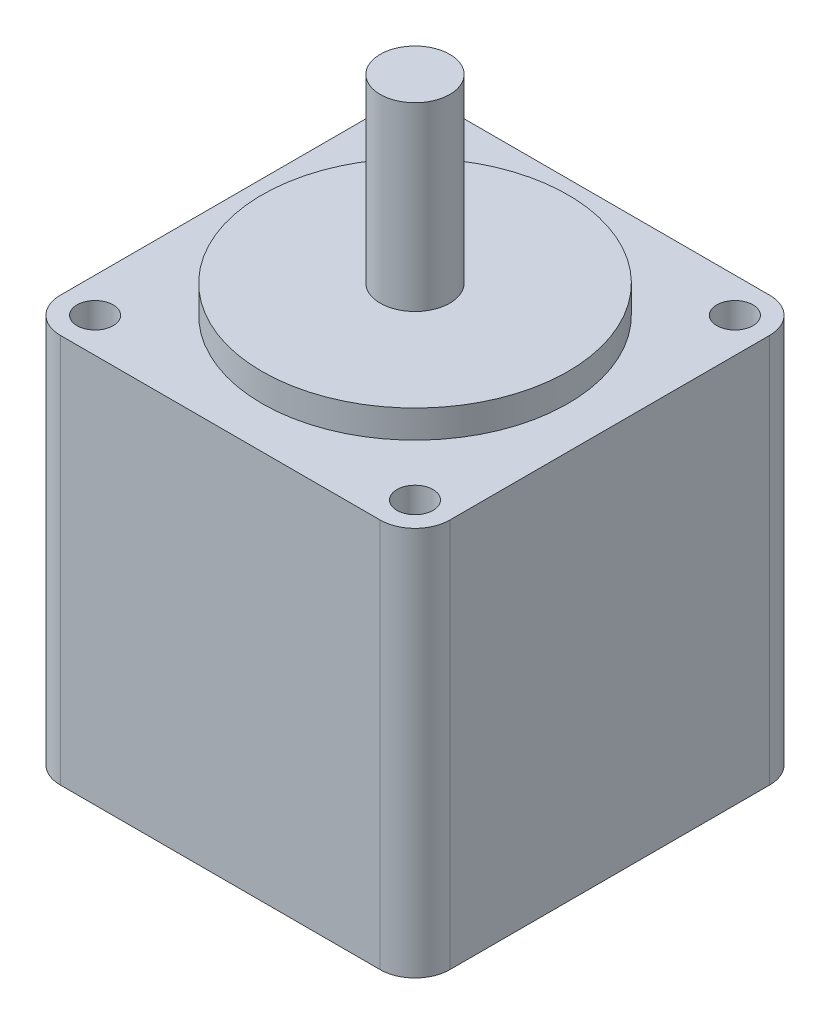
ISO-10303-21;
HEADER;
FILE_DESCRIPTION(('STEP AP214'),'2;1');
FILE_NAME('part.step','',(''),(''),'','','');
FILE_SCHEMA(('AUTOMOTIVE_DESIGN { 1 0 10303 214 1 1 1 1 }'));
ENDSEC;
DATA;
#1=APPLICATION_CONTEXT('core data for automotive mechanical design processes');
#2=APPLICATION_PROTOCOL_DEFINITION('international standard','automotive_design',2000,#1);
#3=PRODUCT_CONTEXT('',#1,'mechanical');
#4=PRODUCT('Part','Part','',(#3));
#5=PRODUCT_RELATED_PRODUCT_CATEGORY('part','',(#4));
#6=PRODUCT_DEFINITION_FORMATION('','',#4);
#7=PRODUCT_DEFINITION_CONTEXT('part definition',#1,'design');
#8=PRODUCT_DEFINITION('design','',#6,#7);
#9=PRODUCT_DEFINITION_SHAPE('','',#8);
#10=(LENGTH_UNIT() NAMED_UNIT(*) SI_UNIT(.MILLI.,.METRE.));
#11=(NAMED_UNIT(*) PLANE_ANGLE_UNIT() SI_UNIT($,.RADIAN.));
#12=(NAMED_UNIT(*) SI_UNIT($,.STERADIAN.) SOLID_ANGLE_UNIT());
#13=UNCERTAINTY_MEASURE_WITH_UNIT(LENGTH_MEASURE(1.E-05),#10,'distance_accuracy_value','');
#14=(GEOMETRIC_REPRESENTATION_CONTEXT(3) GLOBAL_UNCERTAINTY_ASSIGNED_CONTEXT((#13)) GLOBAL_UNIT_ASSIGNED_CONTEXT((#10,
#11,#12)) REPRESENTATION_CONTEXT('',''));
#15=CARTESIAN_POINT('',(0.,0.,0.));
#16=DIRECTION('',(0.,0.,1.));
#17=DIRECTION('',(1.,0.,0.));
#18=AXIS2_PLACEMENT_3D('',#15,#16,#17);
#19=CARTESIAN_POINT('',(-11.5,28.,11.5));
#20=DIRECTION('',(0.,-1.,0.));
#21=DIRECTION('',(0.,0.,-1.));
#22=AXIS2_PLACEMENT_3D('',#19,#20,#21);
#23=CYLINDRICAL_SURFACE('',#22,2.5);
#24=CARTESIAN_POINT('',(-11.5,0.,11.5));
#25=DIRECTION('',(0.,1.,0.));
#26=DIRECTION('',(0.,0.,1.));
#27=AXIS2_PLACEMENT_3D('',#24,#25,#26);
#28=CIRCLE('',#27,2.5);
#29=CARTESIAN_POINT('',(-14.,0.,11.5));
#30=VERTEX_POINT('',#29);
#31=CARTESIAN_POINT('',(-11.5,0.,14.));
#32=VERTEX_POINT('',#31);
#33=EDGE_CURVE('E138',#30,#32,#28,.T.);
#34=ORIENTED_EDGE('',*,*,#33,.T.);
#35=DIRECTION('',(0.,-1.,0.));
#36=VECTOR('',#35,1.);
#37=CARTESIAN_POINT('',(-11.5,28.,14.));
#38=LINE('',#37,#36);
#39=CARTESIAN_POINT('',(-11.5,28.,14.));
#40=VERTEX_POINT('',#39);
#41=EDGE_CURVE('E42',#40,#32,#38,.T.);
#42=ORIENTED_EDGE('',*,*,#41,.F.);
#43=CARTESIAN_POINT('',(-11.5,28.,11.5));
#44=DIRECTION('',(0.,1.,0.));
#45=DIRECTION('',(0.,0.,1.));
#46=AXIS2_PLACEMENT_3D('',#43,#44,#45);
#47=CIRCLE('',#46,2.5);
#48=CARTESIAN_POINT('',(-14.,28.,11.5));
#49=VERTEX_POINT('',#48);
#50=EDGE_CURVE('E154',#49,#40,#47,.T.);
#51=ORIENTED_EDGE('',*,*,#50,.F.);
#52=DIRECTION('',(0.,-1.,0.));
#53=VECTOR('',#52,1.);
#54=CARTESIAN_POINT('',(-14.,28.,11.5));
#55=LINE('',#54,#53);
#56=EDGE_CURVE('E137',#49,#30,#55,.T.);
#57=ORIENTED_EDGE('',*,*,#56,.T.);
#58=EDGE_LOOP('',(#34,#42,#51,#57));
#59=FACE_BOUND('',#58,.T.);
#60=ADVANCED_FACE('F41',(#59),#23,.T.);
#61=CARTESIAN_POINT('',(-11.5,28.,14.));
#62=DIRECTION('',(0.,0.,-1.));
#63=DIRECTION('',(-1.,0.,0.));
#64=AXIS2_PLACEMENT_3D('',#61,#62,#63);
#65=PLANE('',#64);
#66=DIRECTION('',(1.,0.,0.));
#67=VECTOR('',#66,1.);
#68=CARTESIAN_POINT('',(-11.5,0.,14.));
#69=LINE('',#68,#67);
#70=CARTESIAN_POINT('',(11.5,0.,14.));
#71=VERTEX_POINT('',#70);
#72=EDGE_CURVE('E145',#32,#71,#69,.T.);
#73=ORIENTED_EDGE('',*,*,#72,.T.);
#74=DIRECTION('',(0.,-1.,0.));
#75=VECTOR('',#74,1.);
#76=CARTESIAN_POINT('',(11.5,28.,14.));
#77=LINE('',#76,#75);
#78=CARTESIAN_POINT('',(11.5,28.,14.));
#79=VERTEX_POINT('',#78);
#80=EDGE_CURVE('E161',#79,#71,#77,.T.);
#81=ORIENTED_EDGE('',*,*,#80,.F.);
#82=DIRECTION('',(1.,0.,0.));
#83=VECTOR('',#82,1.);
#84=CARTESIAN_POINT('',(-11.5,28.,14.));
#85=LINE('',#84,#83);
#86=EDGE_CURVE('E103',#40,#79,#85,.T.);
#87=ORIENTED_EDGE('',*,*,#86,.F.);
#88=ORIENTED_EDGE('',*,*,#41,.T.);
#89=EDGE_LOOP('',(#73,#81,#87,#88));
#90=FACE_BOUND('',#89,.T.);
#91=ADVANCED_FACE('F209',(#90),#65,.F.);
#92=CARTESIAN_POINT('',(11.5,28.,11.5));
#93=DIRECTION('',(0.,-1.,0.));
#94=DIRECTION('',(0.,0.,-1.));
#95=AXIS2_PLACEMENT_3D('',#92,#93,#94);
#96=CYLINDRICAL_SURFACE('',#95,2.5);
#97=CARTESIAN_POINT('',(11.5,0.,11.5));
#98=DIRECTION('',(0.,1.,0.));
#99=DIRECTION('',(0.,0.,1.));
#100=AXIS2_PLACEMENT_3D('',#97,#98,#99);
#101=CIRCLE('',#100,2.5);
#102=CARTESIAN_POINT('',(14.,0.,11.5));
#103=VERTEX_POINT('',#102);
#104=EDGE_CURVE('E148',#71,#103,#101,.T.);
#105=ORIENTED_EDGE('',*,*,#104,.T.);
#106=DIRECTION('',(0.,-1.,0.));
#107=VECTOR('',#106,1.);
#108=CARTESIAN_POINT('',(14.,28.,11.5));
#109=LINE('',#108,#107);
#110=CARTESIAN_POINT('',(14.,28.,11.5));
#111=VERTEX_POINT('',#110);
#112=EDGE_CURVE('E165',#111,#103,#109,.T.);
#113=ORIENTED_EDGE('',*,*,#112,.F.);
#114=CARTESIAN_POINT('',(11.5,28.,11.5));
#115=DIRECTION('',(0.,1.,0.));
#116=DIRECTION('',(0.,0.,1.));
#117=AXIS2_PLACEMENT_3D('',#114,#115,#116);
#118=CIRCLE('',#117,2.5);
#119=EDGE_CURVE('E178',#79,#111,#118,.T.);
#120=ORIENTED_EDGE('',*,*,#119,.F.);
#121=ORIENTED_EDGE('',*,*,#80,.T.);
#122=EDGE_LOOP('',(#105,#113,#120,#121));
#123=FACE_BOUND('',#122,.T.);
#124=ADVANCED_FACE('F215',(#123),#96,.T.);
#125=CARTESIAN_POINT('',(14.,28.,-11.5));
#126=DIRECTION('',(-1.,0.,0.));
#127=DIRECTION('',(0.,0.,1.));
#128=AXIS2_PLACEMENT_3D('',#125,#126,#127);
#129=PLANE('',#128);
#130=DIRECTION('',(0.,0.,-1.));
#131=VECTOR('',#130,1.);
#132=CARTESIAN_POINT('',(14.,0.,-11.5));
#133=LINE('',#132,#131);
#134=CARTESIAN_POINT('',(14.,0.,-11.5));
#135=VERTEX_POINT('',#134);
#136=EDGE_CURVE('E147',#103,#135,#133,.T.);
#137=ORIENTED_EDGE('',*,*,#136,.T.);
#138=DIRECTION('',(0.,-1.,0.));
#139=VECTOR('',#138,1.);
#140=CARTESIAN_POINT('',(14.,28.,-11.5));
#141=LINE('',#140,#139);
#142=CARTESIAN_POINT('',(14.,28.,-11.5));
#143=VERTEX_POINT('',#142);
#144=EDGE_CURVE('E159',#143,#135,#141,.T.);
#145=ORIENTED_EDGE('',*,*,#144,.F.);
#146=DIRECTION('',(0.,0.,-1.));
#147=VECTOR('',#146,1.);
#148=CARTESIAN_POINT('',(14.,28.,-11.5));
#149=LINE('',#148,#147);
#150=EDGE_CURVE('E179',#111,#143,#149,.T.);
#151=ORIENTED_EDGE('',*,*,#150,.F.);
#152=ORIENTED_EDGE('',*,*,#112,.T.);
#153=EDGE_LOOP('',(#137,#145,#151,#152));
#154=FACE_BOUND('',#153,.T.);
#155=ADVANCED_FACE('F184',(#154),#129,.F.);
#156=CARTESIAN_POINT('',(11.5,28.,-11.5));
#157=DIRECTION('',(0.,-1.,0.));
#158=DIRECTION('',(0.,0.,-1.));
#159=AXIS2_PLACEMENT_3D('',#156,#157,#158);
#160=CYLINDRICAL_SURFACE('',#159,2.5);
#161=CARTESIAN_POINT('',(11.5,0.,-11.5));
#162=DIRECTION('',(0.,1.,0.));
#163=DIRECTION('',(0.,0.,1.));
#164=AXIS2_PLACEMENT_3D('',#161,#162,#163);
#165=CIRCLE('',#164,2.5);
#166=CARTESIAN_POINT('',(11.5,0.,-14.));
#167=VERTEX_POINT('',#166);
#168=EDGE_CURVE('E146',#135,#167,#165,.T.);
#169=ORIENTED_EDGE('',*,*,#168,.T.);
#170=DIRECTION('',(0.,-1.,0.));
#171=VECTOR('',#170,1.);
#172=CARTESIAN_POINT('',(11.5,28.,-14.));
#173=LINE('',#172,#171);
#174=CARTESIAN_POINT('',(11.5,28.,-14.));
#175=VERTEX_POINT('',#174);
#176=EDGE_CURVE('E132',#175,#167,#173,.T.);
#177=ORIENTED_EDGE('',*,*,#176,.F.);
#178=CARTESIAN_POINT('',(11.5,28.,-11.5));
#179=DIRECTION('',(0.,1.,0.));
#180=DIRECTION('',(0.,0.,1.));
#181=AXIS2_PLACEMENT_3D('',#178,#179,#180);
#182=CIRCLE('',#181,2.5);
#183=EDGE_CURVE('E125',#143,#175,#182,.T.);
#184=ORIENTED_EDGE('',*,*,#183,.F.);
#185=ORIENTED_EDGE('',*,*,#144,.T.);
#186=EDGE_LOOP('',(#169,#177,#184,#185));
#187=FACE_BOUND('',#186,.T.);
#188=ADVANCED_FACE('F189',(#187),#160,.T.);
#189=CARTESIAN_POINT('',(-11.5,28.,-14.));
#190=DIRECTION('',(0.,0.,1.));
#191=DIRECTION('',(1.,0.,0.));
#192=AXIS2_PLACEMENT_3D('',#189,#190,#191);
#193=PLANE('',#192);
#194=DIRECTION('',(-1.,0.,0.));
#195=VECTOR('',#194,1.);
#196=CARTESIAN_POINT('',(-11.5,0.,-14.));
#197=LINE('',#196,#195);
#198=CARTESIAN_POINT('',(-11.5,0.,-14.));
#199=VERTEX_POINT('',#198);
#200=EDGE_CURVE('E129',#167,#199,#197,.T.);
#201=ORIENTED_EDGE('',*,*,#200,.T.);
#202=DIRECTION('',(0.,-1.,0.));
#203=VECTOR('',#202,1.);
#204=CARTESIAN_POINT('',(-11.5,28.,-14.));
#205=LINE('',#204,#203);
#206=CARTESIAN_POINT('',(-11.5,28.,-14.));
#207=VERTEX_POINT('',#206);
#208=EDGE_CURVE('E130',#207,#199,#205,.T.);
#209=ORIENTED_EDGE('',*,*,#208,.F.);
#210=DIRECTION('',(-1.,0.,0.));
#211=VECTOR('',#210,1.);
#212=CARTESIAN_POINT('',(-11.5,28.,-14.));
#213=LINE('',#212,#211);
#214=EDGE_CURVE('E116',#175,#207,#213,.T.);
#215=ORIENTED_EDGE('',*,*,#214,.F.);
#216=ORIENTED_EDGE('',*,*,#176,.T.);
#217=EDGE_LOOP('',(#201,#209,#215,#216));
#218=FACE_BOUND('',#217,.T.);
#219=ADVANCED_FACE('F127',(#218),#193,.F.);
#220=CARTESIAN_POINT('',(-11.5,28.,-11.5));
#221=DIRECTION('',(0.,-1.,0.));
#222=DIRECTION('',(0.,0.,-1.));
#223=AXIS2_PLACEMENT_3D('',#220,#221,#222);
#224=CYLINDRICAL_SURFACE('',#223,2.5);
#225=CARTESIAN_POINT('',(-11.5,0.,-11.5));
#226=DIRECTION('',(0.,1.,0.));
#227=DIRECTION('',(0.,0.,-1.));
#228=AXIS2_PLACEMENT_3D('',#225,#226,#227);
#229=CIRCLE('',#228,2.5);
#230=CARTESIAN_POINT('',(-14.,0.,-11.5));
#231=VERTEX_POINT('',#230);
#232=EDGE_CURVE('E89',#199,#231,#229,.T.);
#233=ORIENTED_EDGE('',*,*,#232,.T.);
#234=DIRECTION('',(0.,-1.,0.));
#235=VECTOR('',#234,1.);
#236=CARTESIAN_POINT('',(-14.,28.,-11.5));
#237=LINE('',#236,#235);
#238=CARTESIAN_POINT('',(-14.,28.,-11.5));
#239=VERTEX_POINT('',#238);
#240=EDGE_CURVE('E135',#239,#231,#237,.T.);
#241=ORIENTED_EDGE('',*,*,#240,.F.);
#242=CARTESIAN_POINT('',(-11.5,28.,-11.5));
#243=DIRECTION('',(0.,1.,0.));
#244=DIRECTION('',(0.,0.,-1.));
#245=AXIS2_PLACEMENT_3D('',#242,#243,#244);
#246=CIRCLE('',#245,2.5);
#247=EDGE_CURVE('E119',#207,#239,#246,.T.);
#248=ORIENTED_EDGE('',*,*,#247,.F.);
#249=ORIENTED_EDGE('',*,*,#208,.T.);
#250=EDGE_LOOP('',(#233,#241,#248,#249));
#251=FACE_BOUND('',#250,.T.);
#252=ADVANCED_FACE('F131',(#251),#224,.T.);
#253=CARTESIAN_POINT('',(-14.,28.,-11.5));
#254=DIRECTION('',(1.,0.,0.));
#255=DIRECTION('',(0.,0.,-1.));
#256=AXIS2_PLACEMENT_3D('',#253,#254,#255);
#257=PLANE('',#256);
#258=DIRECTION('',(0.,0.,1.));
#259=VECTOR('',#258,1.);
#260=CARTESIAN_POINT('',(-14.,0.,-11.5));
#261=LINE('',#260,#259);
#262=EDGE_CURVE('E91',#231,#30,#261,.T.);
#263=ORIENTED_EDGE('',*,*,#262,.T.);
#264=ORIENTED_EDGE('',*,*,#56,.F.);
#265=DIRECTION('',(0.,0.,1.));
#266=VECTOR('',#265,1.);
#267=CARTESIAN_POINT('',(-14.,28.,-11.5));
#268=LINE('',#267,#266);
#269=EDGE_CURVE('E56',#239,#49,#268,.T.);
#270=ORIENTED_EDGE('',*,*,#269,.F.);
#271=ORIENTED_EDGE('',*,*,#240,.T.);
#272=EDGE_LOOP('',(#263,#264,#270,#271));
#273=FACE_BOUND('',#272,.T.);
#274=ADVANCED_FACE('F194',(#273),#257,.F.);
#275=CARTESIAN_POINT('',(-11.5,28.,11.5));
#276=DIRECTION('',(0.,1.,0.));
#277=DIRECTION('',(0.,0.,1.));
#278=AXIS2_PLACEMENT_3D('',#275,#276,#277);
#279=PLANE('',#278);
#280=CARTESIAN_POINT('',(11.5,28.,11.5));
#281=DIRECTION('',(0.,1.,0.));
#282=DIRECTION('',(0.,0.,1.));
#283=AXIS2_PLACEMENT_3D('',#280,#281,#282);
#284=CIRCLE('',#283,1.3);
#285=CARTESIAN_POINT('',(11.5,28.,12.8));
#286=VERTEX_POINT('',#285);
#287=EDGE_CURVE('E376',#286,#286,#284,.T.);
#288=ORIENTED_EDGE('',*,*,#287,.F.);
#289=EDGE_LOOP('',(#288));
#290=FACE_BOUND('',#289,.T.);
#291=CARTESIAN_POINT('',(11.5,28.,-11.5));
#292=DIRECTION('',(0.,1.,0.));
#293=DIRECTION('',(0.,0.,1.));
#294=AXIS2_PLACEMENT_3D('',#291,#292,#293);
#295=CIRCLE('',#294,1.3);
#296=CARTESIAN_POINT('',(11.5,28.,-10.2));
#297=VERTEX_POINT('',#296);
#298=EDGE_CURVE('E371',#297,#297,#295,.T.);
#299=ORIENTED_EDGE('',*,*,#298,.F.);
#300=EDGE_LOOP('',(#299));
#301=FACE_BOUND('',#300,.T.);
#302=CARTESIAN_POINT('',(-11.5,28.,-11.5));
#303=DIRECTION('',(0.,1.,0.));
#304=DIRECTION('',(0.,0.,1.));
#305=AXIS2_PLACEMENT_3D('',#302,#303,#304);
#306=CIRCLE('',#305,1.3);
#307=CARTESIAN_POINT('',(-11.5,28.,-10.2));
#308=VERTEX_POINT('',#307);
#309=EDGE_CURVE('E403',#308,#308,#306,.T.);
#310=ORIENTED_EDGE('',*,*,#309,.F.);
#311=EDGE_LOOP('',(#310));
#312=FACE_BOUND('',#311,.T.);
#313=CARTESIAN_POINT('',(-11.5,28.,11.5));
#314=DIRECTION('',(0.,1.,0.));
#315=DIRECTION('',(0.,0.,1.));
#316=AXIS2_PLACEMENT_3D('',#313,#314,#315);
#317=CIRCLE('',#316,1.3);
#318=CARTESIAN_POINT('',(-11.5,28.,12.8));
#319=VERTEX_POINT('',#318);
#320=EDGE_CURVE('E386',#319,#319,#317,.T.);
#321=ORIENTED_EDGE('',*,*,#320,.F.);
#322=EDGE_LOOP('',(#321));
#323=FACE_BOUND('',#322,.T.);
#324=CARTESIAN_POINT('',(0.,28.,0.));
#325=DIRECTION('',(0.,1.,0.));
#326=DIRECTION('',(0.,0.,1.));
#327=AXIS2_PLACEMENT_3D('',#324,#325,#326);
#328=CIRCLE('',#327,11.);
#329=CARTESIAN_POINT('',(0.,28.,11.));
#330=VERTEX_POINT('',#329);
#331=EDGE_CURVE('E49',#330,#330,#328,.T.);
#332=ORIENTED_EDGE('',*,*,#331,.F.);
#333=EDGE_LOOP('',(#332));
#334=FACE_BOUND('',#333,.T.);
#335=ORIENTED_EDGE('',*,*,#50,.T.);
#336=ORIENTED_EDGE('',*,*,#86,.T.);
#337=ORIENTED_EDGE('',*,*,#119,.T.);
#338=ORIENTED_EDGE('',*,*,#150,.T.);
#339=ORIENTED_EDGE('',*,*,#183,.T.);
#340=ORIENTED_EDGE('',*,*,#214,.T.);
#341=ORIENTED_EDGE('',*,*,#247,.T.);
#342=ORIENTED_EDGE('',*,*,#269,.T.);
#343=EDGE_LOOP('',(#335,#336,#337,#338,#339,#340,#341,#342));
#344=FACE_BOUND('',#343,.T.);
#345=ADVANCED_FACE('F118',(#290,#301,#312,#323,#334,#344),#279,.T.);
#346=CARTESIAN_POINT('',(-11.5,0.,11.5));
#347=DIRECTION('',(0.,1.,0.));
#348=DIRECTION('',(0.,0.,1.));
#349=AXIS2_PLACEMENT_3D('',#346,#347,#348);
#350=PLANE('',#349);
#351=ORIENTED_EDGE('',*,*,#33,.F.);
#352=ORIENTED_EDGE('',*,*,#262,.F.);
#353=ORIENTED_EDGE('',*,*,#232,.F.);
#354=ORIENTED_EDGE('',*,*,#200,.F.);
#355=ORIENTED_EDGE('',*,*,#168,.F.);
#356=ORIENTED_EDGE('',*,*,#136,.F.);
#357=ORIENTED_EDGE('',*,*,#104,.F.);
#358=ORIENTED_EDGE('',*,*,#72,.F.);
#359=EDGE_LOOP('',(#351,#352,#353,#354,#355,#356,#357,#358));
#360=FACE_BOUND('',#359,.T.);
#361=ADVANCED_FACE('F195',(#360),#350,.F.);
#362=CARTESIAN_POINT('',(0.,30.,0.));
#363=DIRECTION('',(0.,-1.,0.));
#364=DIRECTION('',(0.,0.,-1.));
#365=AXIS2_PLACEMENT_3D('',#362,#363,#364);
#366=CYLINDRICAL_SURFACE('',#365,11.);
#367=CARTESIAN_POINT('',(0.,30.,0.));
#368=DIRECTION('',(0.,1.,0.));
#369=DIRECTION('',(0.,0.,1.));
#370=AXIS2_PLACEMENT_3D('',#367,#368,#369);
#371=CIRCLE('',#370,11.);
#372=CARTESIAN_POINT('',(0.,30.,11.));
#373=VERTEX_POINT('',#372);
#374=EDGE_CURVE('E141',#373,#373,#371,.T.);
#375=ORIENTED_EDGE('',*,*,#374,.F.);
#376=EDGE_LOOP('',(#375));
#377=FACE_BOUND('',#376,.T.);
#378=ORIENTED_EDGE('',*,*,#331,.T.);
#379=EDGE_LOOP('',(#378));
#380=FACE_BOUND('',#379,.T.);
#381=ADVANCED_FACE('F253',(#377,#380),#366,.T.);
#382=CARTESIAN_POINT('',(0.,30.,0.));
#383=DIRECTION('',(0.,1.,0.));
#384=DIRECTION('',(0.,0.,1.));
#385=AXIS2_PLACEMENT_3D('',#382,#383,#384);
#386=PLANE('',#385);
#387=CARTESIAN_POINT('',(0.,30.,0.));
#388=DIRECTION('',(0.,1.,0.));
#389=DIRECTION('',(0.,0.,1.));
#390=AXIS2_PLACEMENT_3D('',#387,#388,#389);
#391=CIRCLE('',#390,2.5);
#392=CARTESIAN_POINT('',(0.,30.,-2.5));
#393=VERTEX_POINT('',#392);
#394=EDGE_CURVE('E11',#393,#393,#391,.T.);
#395=ORIENTED_EDGE('',*,*,#394,.F.);
#396=EDGE_LOOP('',(#395));
#397=FACE_BOUND('',#396,.T.);
#398=ORIENTED_EDGE('',*,*,#374,.T.);
#399=EDGE_LOOP('',(#398));
#400=FACE_BOUND('',#399,.T.);
#401=ADVANCED_FACE('F263',(#397,#400),#386,.T.);
#402=CARTESIAN_POINT('',(0.,43.,0.));
#403=DIRECTION('',(0.,-1.,0.));
#404=DIRECTION('',(0.,0.,-1.));
#405=AXIS2_PLACEMENT_3D('',#402,#403,#404);
#406=CYLINDRICAL_SURFACE('',#405,2.5);
#407=CARTESIAN_POINT('',(0.,43.,0.));
#408=DIRECTION('',(0.,1.,0.));
#409=DIRECTION('',(0.,0.,1.));
#410=AXIS2_PLACEMENT_3D('',#407,#408,#409);
#411=CIRCLE('',#410,2.5);
#412=CARTESIAN_POINT('',(0.,43.,-2.5));
#413=VERTEX_POINT('',#412);
#414=EDGE_CURVE('E389',#413,#413,#411,.T.);
#415=CARTESIAN_POINT('',(0.,43.,-2.5));
#416=CARTESIAN_POINT('',(0.,42.8645833333333,-2.5));
#417=CARTESIAN_POINT('',(0.,42.7291666666667,-2.5));
#418=CARTESIAN_POINT('',(0.,42.4583333333333,-2.5));
#419=CARTESIAN_POINT('',(0.,42.3229166666667,-2.5));
#420=CARTESIAN_POINT('',(0.,42.0520833333333,-2.5));
#421=CARTESIAN_POINT('',(0.,41.9166666666667,-2.5));
#422=CARTESIAN_POINT('',(0.,41.6458333333333,-2.5));
#423=CARTESIAN_POINT('',(0.,41.5104166666667,-2.5));
#424=CARTESIAN_POINT('',(0.,41.2395833333333,-2.5));
#425=CARTESIAN_POINT('',(0.,41.1041666666667,-2.5));
#426=CARTESIAN_POINT('',(0.,40.8333333333333,-2.5));
#427=CARTESIAN_POINT('',(0.,40.6979166666667,-2.5));
#428=CARTESIAN_POINT('',(0.,40.4270833333333,-2.5));
#429=CARTESIAN_POINT('',(0.,40.2916666666667,-2.5));
#430=CARTESIAN_POINT('',(0.,40.0208333333333,-2.5));
#431=CARTESIAN_POINT('',(0.,39.8854166666667,-2.5));
#432=CARTESIAN_POINT('',(0.,39.6145833333333,-2.5));
#433=CARTESIAN_POINT('',(0.,39.4791666666667,-2.5));
#434=CARTESIAN_POINT('',(0.,39.2083333333333,-2.5));
#435=CARTESIAN_POINT('',(0.,39.0729166666667,-2.5));
#436=CARTESIAN_POINT('',(0.,38.8020833333333,-2.5));
#437=CARTESIAN_POINT('',(0.,38.6666666666667,-2.5));
#438=CARTESIAN_POINT('',(0.,38.3958333333333,-2.5));
#439=CARTESIAN_POINT('',(0.,38.2604166666667,-2.5));
#440=CARTESIAN_POINT('',(0.,37.9895833333333,-2.5));
#441=CARTESIAN_POINT('',(0.,37.8541666666667,-2.5));
#442=CARTESIAN_POINT('',(0.,37.5833333333333,-2.5));
#443=CARTESIAN_POINT('',(0.,37.4479166666667,-2.5));
#444=CARTESIAN_POINT('',(0.,37.1770833333333,-2.5));
#445=CARTESIAN_POINT('',(0.,37.0416666666667,-2.5));
#446=CARTESIAN_POINT('',(0.,36.7708333333333,-2.5));
#447=CARTESIAN_POINT('',(0.,36.6354166666667,-2.5));
#448=CARTESIAN_POINT('',(0.,36.3645833333333,-2.5));
#449=CARTESIAN_POINT('',(0.,36.2291666666667,-2.5));
#450=CARTESIAN_POINT('',(0.,35.9583333333333,-2.5));
#451=CARTESIAN_POINT('',(0.,35.8229166666667,-2.5));
#452=CARTESIAN_POINT('',(0.,35.5520833333333,-2.5));
#453=CARTESIAN_POINT('',(0.,35.4166666666667,-2.5));
#454=CARTESIAN_POINT('',(0.,35.1458333333333,-2.5));
#455=CARTESIAN_POINT('',(0.,35.0104166666667,-2.5));
#456=CARTESIAN_POINT('',(0.,34.7395833333333,-2.5));
#457=CARTESIAN_POINT('',(0.,34.6041666666667,-2.5));
#458=CARTESIAN_POINT('',(0.,34.3333333333333,-2.5));
#459=CARTESIAN_POINT('',(0.,34.1979166666667,-2.5));
#460=CARTESIAN_POINT('',(0.,33.9270833333333,-2.5));
#461=CARTESIAN_POINT('',(0.,33.7916666666667,-2.5));
#462=CARTESIAN_POINT('',(0.,33.5208333333333,-2.5));
#463=CARTESIAN_POINT('',(0.,33.3854166666667,-2.5));
#464=CARTESIAN_POINT('',(0.,33.1145833333333,-2.5));
#465=CARTESIAN_POINT('',(0.,32.9791666666667,-2.5));
#466=CARTESIAN_POINT('',(0.,32.7083333333333,-2.5));
#467=CARTESIAN_POINT('',(0.,32.5729166666667,-2.5));
#468=CARTESIAN_POINT('',(0.,32.3020833333333,-2.5));
#469=CARTESIAN_POINT('',(0.,32.1666666666667,-2.5));
#470=CARTESIAN_POINT('',(0.,31.8958333333333,-2.5));
#471=CARTESIAN_POINT('',(0.,31.7604166666667,-2.5));
#472=CARTESIAN_POINT('',(0.,31.4895833333333,-2.5));
#473=CARTESIAN_POINT('',(0.,31.3541666666667,-2.5));
#474=CARTESIAN_POINT('',(0.,31.0833333333333,-2.5));
#475=CARTESIAN_POINT('',(0.,30.9479166666667,-2.5));
#476=CARTESIAN_POINT('',(0.,30.6770833333333,-2.5));
#477=CARTESIAN_POINT('',(0.,30.5416666666667,-2.5));
#478=CARTESIAN_POINT('',(0.,30.2708333333333,-2.5));
#479=CARTESIAN_POINT('',(0.,30.1354166666667,-2.5));
#480=CARTESIAN_POINT('',(0.,30.,-2.5));
#481=B_SPLINE_CURVE_WITH_KNOTS('',3,(#415,#416,#417,#418,#419,#420,#421,#422,#423,#424,#425,
#426,#427,#428,#429,#430,#431,#432,#433,#434,#435,#436,#437,#438,#439,#440,#441,#442,#443,#444,
#445,#446,#447,#448,#449,#450,#451,#452,#453,#454,#455,#456,#457,#458,#459,#460,#461,#462,#463,
#464,#465,#466,#467,#468,#469,#470,#471,#472,#473,#474,#475,#476,#477,#478,#479,#480),
.UNSPECIFIED.,.F.,.F.,(4,2,2,2,2,2,2,2,2,2,2,2,2,2,2,2,2,2,2,2,2,2,2,2,2,2,2,2,2,2,2,2,4),(0.,
0.406249999999997,0.812499999999994,1.21875,1.62499999999999,2.03125,2.4375,2.84375,3.25,
3.65624999999999,4.0625,4.46874999999999,4.875,5.28124999999999,5.68749999999999,
6.09374999999999,6.49999999999999,6.90625,7.31249999999999,7.71875,8.12499999999999,8.53125,
8.93749999999999,9.34374999999999,9.74999999999999,10.15625,10.5625,10.96875,11.375,11.78125,
12.1875,12.59375,13.),.UNSPECIFIED.);
#482=EDGE_CURVE('BSEAM271',#413,#393,#481,.T.);
#483=ORIENTED_EDGE('',*,*,#414,.F.);
#484=ORIENTED_EDGE('',*,*,#394,.T.);
#485=ORIENTED_EDGE('',*,*,#482,.T.);
#486=ORIENTED_EDGE('',*,*,#482,.F.);
#487=EDGE_LOOP('',(#483,#485,#484,#486));
#488=FACE_BOUND('',#487,.T.);
#489=ADVANCED_FACE('F271',(#488),#406,.T.);
#490=CARTESIAN_POINT('',(0.,43.,0.));
#491=DIRECTION('',(0.,1.,0.));
#492=DIRECTION('',(0.,0.,1.));
#493=AXIS2_PLACEMENT_3D('',#490,#491,#492);
#494=PLANE('',#493);
#495=ORIENTED_EDGE('',*,*,#414,.T.);
#496=EDGE_LOOP('',(#495));
#497=FACE_BOUND('',#496,.T.);
#498=ADVANCED_FACE('F282',(#497),#494,.T.);
#499=CARTESIAN_POINT('',(-11.5,23.,11.5));
#500=DIRECTION('',(0.,1.,0.));
#501=DIRECTION('',(0.,0.,1.));
#502=AXIS2_PLACEMENT_3D('',#499,#500,#501);
#503=CYLINDRICAL_SURFACE('',#502,1.3);
#504=CARTESIAN_POINT('',(-11.5,23.,11.5));
#505=DIRECTION('',(0.,1.,0.));
#506=DIRECTION('',(0.,0.,1.));
#507=AXIS2_PLACEMENT_3D('',#504,#505,#506);
#508=CIRCLE('',#507,1.3);
#509=CARTESIAN_POINT('',(-11.5,23.,12.8));
#510=VERTEX_POINT('',#509);
#511=EDGE_CURVE('E383',#510,#510,#508,.T.);
#512=ORIENTED_EDGE('',*,*,#511,.F.);
#513=EDGE_LOOP('',(#512));
#514=FACE_BOUND('',#513,.T.);
#515=ORIENTED_EDGE('',*,*,#320,.T.);
#516=EDGE_LOOP('',(#515));
#517=FACE_BOUND('',#516,.T.);
#518=ADVANCED_FACE('F288',(#514,#517),#503,.F.);
#519=CARTESIAN_POINT('',(-11.5,23.,11.5));
#520=DIRECTION('',(0.,1.,0.));
#521=DIRECTION('',(0.,0.,1.));
#522=AXIS2_PLACEMENT_3D('',#519,#520,#521);
#523=PLANE('',#522);
#524=ORIENTED_EDGE('',*,*,#511,.T.);
#525=EDGE_LOOP('',(#524));
#526=FACE_BOUND('',#525,.T.);
#527=ADVANCED_FACE('F300',(#526),#523,.T.);
#528=CARTESIAN_POINT('',(-11.5,23.,-11.5));
#529=DIRECTION('',(0.,1.,0.));
#530=DIRECTION('',(0.,0.,1.));
#531=AXIS2_PLACEMENT_3D('',#528,#529,#530);
#532=CYLINDRICAL_SURFACE('',#531,1.3);
#533=CARTESIAN_POINT('',(-11.5,23.,-11.5));
#534=DIRECTION('',(0.,1.,0.));
#535=DIRECTION('',(0.,0.,1.));
#536=AXIS2_PLACEMENT_3D('',#533,#534,#535);
#537=CIRCLE('',#536,1.3);
#538=CARTESIAN_POINT('',(-11.5,23.,-10.2));
#539=VERTEX_POINT('',#538);
#540=EDGE_CURVE('E394',#539,#539,#537,.T.);
#541=ORIENTED_EDGE('',*,*,#540,.F.);
#542=EDGE_LOOP('',(#541));
#543=FACE_BOUND('',#542,.T.);
#544=ORIENTED_EDGE('',*,*,#309,.T.);
#545=EDGE_LOOP('',(#544));
#546=FACE_BOUND('',#545,.T.);
#547=ADVANCED_FACE('F309',(#543,#546),#532,.F.);
#548=CARTESIAN_POINT('',(-11.5,23.,-11.5));
#549=DIRECTION('',(0.,1.,0.));
#550=DIRECTION('',(0.,0.,1.));
#551=AXIS2_PLACEMENT_3D('',#548,#549,#550);
#552=PLANE('',#551);
#553=ORIENTED_EDGE('',*,*,#540,.T.);
#554=EDGE_LOOP('',(#553));
#555=FACE_BOUND('',#554,.T.);
#556=ADVANCED_FACE('F316',(#555),#552,.T.);
#557=CARTESIAN_POINT('',(11.5,23.,-11.5));
#558=DIRECTION('',(0.,1.,0.));
#559=DIRECTION('',(0.,0.,1.));
#560=AXIS2_PLACEMENT_3D('',#557,#558,#559);
#561=CYLINDRICAL_SURFACE('',#560,1.3);
#562=CARTESIAN_POINT('',(11.5,23.,-11.5));
#563=DIRECTION('',(0.,1.,0.));
#564=DIRECTION('',(0.,0.,1.));
#565=AXIS2_PLACEMENT_3D('',#562,#563,#564);
#566=CIRCLE('',#565,1.3);
#567=CARTESIAN_POINT('',(11.5,23.,-10.2));
#568=VERTEX_POINT('',#567);
#569=EDGE_CURVE('E377',#568,#568,#566,.T.);
#570=ORIENTED_EDGE('',*,*,#569,.F.);
#571=EDGE_LOOP('',(#570));
#572=FACE_BOUND('',#571,.T.);
#573=ORIENTED_EDGE('',*,*,#298,.T.);
#574=EDGE_LOOP('',(#573));
#575=FACE_BOUND('',#574,.T.);
#576=ADVANCED_FACE('F327',(#572,#575),#561,.F.);
#577=CARTESIAN_POINT('',(11.5,23.,-11.5));
#578=DIRECTION('',(0.,1.,0.));
#579=DIRECTION('',(0.,0.,1.));
#580=AXIS2_PLACEMENT_3D('',#577,#578,#579);
#581=PLANE('',#580);
#582=ORIENTED_EDGE('',*,*,#569,.T.);
#583=EDGE_LOOP('',(#582));
#584=FACE_BOUND('',#583,.T.);
#585=ADVANCED_FACE('F339',(#584),#581,.T.);
#586=CARTESIAN_POINT('',(11.5,23.,11.5));
#587=DIRECTION('',(0.,1.,0.));
#588=DIRECTION('',(0.,0.,1.));
#589=AXIS2_PLACEMENT_3D('',#586,#587,#588);
#590=CYLINDRICAL_SURFACE('',#589,1.3);
#591=CARTESIAN_POINT('',(11.5,23.,11.5));
#592=DIRECTION('',(0.,1.,0.));
#593=DIRECTION('',(0.,0.,1.));
#594=AXIS2_PLACEMENT_3D('',#591,#592,#593);
#595=CIRCLE('',#594,1.3);
#596=CARTESIAN_POINT('',(11.5,23.,12.8));
#597=VERTEX_POINT('',#596);
#598=EDGE_CURVE('E375',#597,#597,#595,.T.);
#599=ORIENTED_EDGE('',*,*,#598,.F.);
#600=EDGE_LOOP('',(#599));
#601=FACE_BOUND('',#600,.T.);
#602=ORIENTED_EDGE('',*,*,#287,.T.);
#603=EDGE_LOOP('',(#602));
#604=FACE_BOUND('',#603,.T.);
#605=ADVANCED_FACE('F347',(#601,#604),#590,.F.);
#606=CARTESIAN_POINT('',(11.5,23.,11.5));
#607=DIRECTION('',(0.,1.,0.));
#608=DIRECTION('',(0.,0.,1.));
#609=AXIS2_PLACEMENT_3D('',#606,#607,#608);
#610=PLANE('',#609);
#611=ORIENTED_EDGE('',*,*,#598,.T.);
#612=EDGE_LOOP('',(#611));
#613=FACE_BOUND('',#612,.T.);
#614=ADVANCED_FACE('F356',(#613),#610,.T.);
#615=CLOSED_SHELL('',(#60,#91,#124,#155,#188,#219,#252,#274,#345,#361,#381,#401,#489,#498,#518,
#527,#547,#556,#576,#585,#605,#614));
#616=MANIFOLD_SOLID_BREP('B2',#615);
#617=ADVANCED_BREP_SHAPE_REPRESENTATION('',(#18,#616),#14);
#618=SHAPE_DEFINITION_REPRESENTATION(#9,#617);
ENDSEC;
END-ISO-10303-21;
